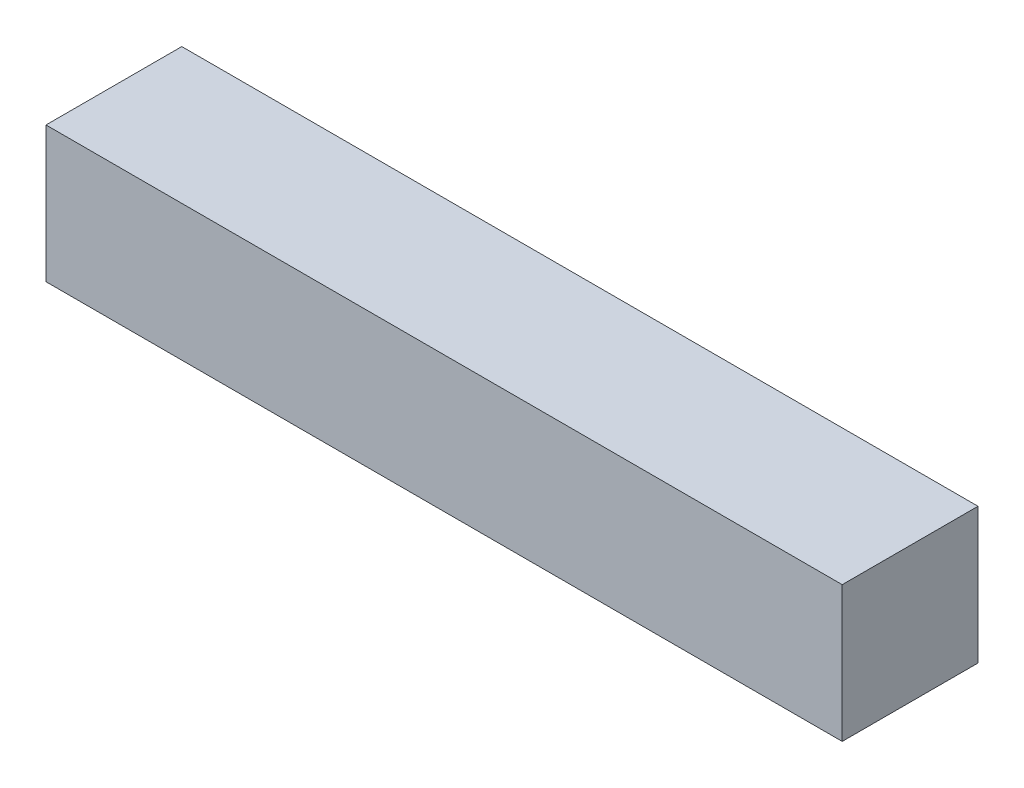
ISO-10303-21;
HEADER;
FILE_DESCRIPTION(('STEP AP214'),'2;1');
FILE_NAME('part.step','',(''),(''),'','','');
FILE_SCHEMA(('AUTOMOTIVE_DESIGN { 1 0 10303 214 1 1 1 1 }'));
ENDSEC;
DATA;
#1=APPLICATION_CONTEXT('core data for automotive mechanical design processes');
#2=APPLICATION_PROTOCOL_DEFINITION('international standard','automotive_design',2000,#1);
#3=PRODUCT_CONTEXT('',#1,'mechanical');
#4=PRODUCT('Part','Part','',(#3));
#5=PRODUCT_RELATED_PRODUCT_CATEGORY('part','',(#4));
#6=PRODUCT_DEFINITION_FORMATION('','',#4);
#7=PRODUCT_DEFINITION_CONTEXT('part definition',#1,'design');
#8=PRODUCT_DEFINITION('design','',#6,#7);
#9=PRODUCT_DEFINITION_SHAPE('','',#8);
#10=(LENGTH_UNIT() NAMED_UNIT(*) SI_UNIT(.MILLI.,.METRE.));
#11=(NAMED_UNIT(*) PLANE_ANGLE_UNIT() SI_UNIT($,.RADIAN.));
#12=(NAMED_UNIT(*) SI_UNIT($,.STERADIAN.) SOLID_ANGLE_UNIT());
#13=UNCERTAINTY_MEASURE_WITH_UNIT(LENGTH_MEASURE(1.E-05),#10,'distance_accuracy_value','');
#14=(GEOMETRIC_REPRESENTATION_CONTEXT(3) GLOBAL_UNCERTAINTY_ASSIGNED_CONTEXT((#13)) GLOBAL_UNIT_ASSIGNED_CONTEXT((#10,
#11,#12)) REPRESENTATION_CONTEXT('',''));
#15=CARTESIAN_POINT('',(0.,0.,0.));
#16=DIRECTION('',(0.,0.,1.));
#17=DIRECTION('',(1.,0.,0.));
#18=AXIS2_PLACEMENT_3D('',#15,#16,#17);
#19=CARTESIAN_POINT('',(387.,-33.,-33.));
#20=DIRECTION('',(0.,0.,1.));
#21=DIRECTION('',(1.,0.,0.));
#22=AXIS2_PLACEMENT_3D('',#19,#20,#21);
#23=PLANE('',#22);
#24=DIRECTION('',(0.,1.,0.));
#25=VECTOR('',#24,1.);
#26=CARTESIAN_POINT('',(0.,-33.,-33.));
#27=LINE('',#26,#25);
#28=CARTESIAN_POINT('',(0.,-33.,-33.));
#29=VERTEX_POINT('',#28);
#30=CARTESIAN_POINT('',(0.,33.,-33.));
#31=VERTEX_POINT('',#30);
#32=EDGE_CURVE('E107',#29,#31,#27,.T.);
#33=ORIENTED_EDGE('',*,*,#32,.T.);
#34=DIRECTION('',(-1.,0.,0.));
#35=VECTOR('',#34,1.);
#36=CARTESIAN_POINT('',(387.,33.,-33.));
#37=LINE('',#36,#35);
#38=CARTESIAN_POINT('',(387.,33.,-33.));
#39=VERTEX_POINT('',#38);
#40=EDGE_CURVE('E11',#39,#31,#37,.T.);
#41=ORIENTED_EDGE('',*,*,#40,.F.);
#42=DIRECTION('',(0.,1.,0.));
#43=VECTOR('',#42,1.);
#44=CARTESIAN_POINT('',(387.,-33.,-33.));
#45=LINE('',#44,#43);
#46=CARTESIAN_POINT('',(387.,-33.,-33.));
#47=VERTEX_POINT('',#46);
#48=EDGE_CURVE('E91',#47,#39,#45,.T.);
#49=ORIENTED_EDGE('',*,*,#48,.F.);
#50=DIRECTION('',(-1.,0.,0.));
#51=VECTOR('',#50,1.);
#52=CARTESIAN_POINT('',(387.,-33.,-33.));
#53=LINE('',#52,#51);
#54=EDGE_CURVE('E103',#47,#29,#53,.T.);
#55=ORIENTED_EDGE('',*,*,#54,.T.);
#56=EDGE_LOOP('',(#33,#41,#49,#55));
#57=FACE_BOUND('',#56,.T.);
#58=ADVANCED_FACE('F39',(#57),#23,.F.);
#59=CARTESIAN_POINT('',(387.,33.,33.));
#60=DIRECTION('',(0.,-1.,0.));
#61=DIRECTION('',(0.,0.,-1.));
#62=AXIS2_PLACEMENT_3D('',#59,#60,#61);
#63=PLANE('',#62);
#64=DIRECTION('',(0.,0.,1.));
#65=VECTOR('',#64,1.);
#66=CARTESIAN_POINT('',(0.,33.,33.));
#67=LINE('',#66,#65);
#68=CARTESIAN_POINT('',(0.,33.,33.));
#69=VERTEX_POINT('',#68);
#70=EDGE_CURVE('E96',#31,#69,#67,.T.);
#71=ORIENTED_EDGE('',*,*,#70,.T.);
#72=DIRECTION('',(-1.,0.,0.));
#73=VECTOR('',#72,1.);
#74=CARTESIAN_POINT('',(387.,33.,33.));
#75=LINE('',#74,#73);
#76=CARTESIAN_POINT('',(387.,33.,33.));
#77=VERTEX_POINT('',#76);
#78=EDGE_CURVE('E48',#77,#69,#75,.T.);
#79=ORIENTED_EDGE('',*,*,#78,.F.);
#80=DIRECTION('',(0.,0.,1.));
#81=VECTOR('',#80,1.);
#82=CARTESIAN_POINT('',(387.,33.,33.));
#83=LINE('',#82,#81);
#84=EDGE_CURVE('E86',#39,#77,#83,.T.);
#85=ORIENTED_EDGE('',*,*,#84,.F.);
#86=ORIENTED_EDGE('',*,*,#40,.T.);
#87=EDGE_LOOP('',(#71,#79,#85,#86));
#88=FACE_BOUND('',#87,.T.);
#89=ADVANCED_FACE('F95',(#88),#63,.F.);
#90=CARTESIAN_POINT('',(387.,-33.,33.));
#91=DIRECTION('',(0.,0.,-1.));
#92=DIRECTION('',(-1.,0.,0.));
#93=AXIS2_PLACEMENT_3D('',#90,#91,#92);
#94=PLANE('',#93);
#95=DIRECTION('',(0.,-1.,0.));
#96=VECTOR('',#95,1.);
#97=CARTESIAN_POINT('',(0.,-33.,33.));
#98=LINE('',#97,#96);
#99=CARTESIAN_POINT('',(0.,-33.,33.));
#100=VERTEX_POINT('',#99);
#101=EDGE_CURVE('E73',#69,#100,#98,.T.);
#102=ORIENTED_EDGE('',*,*,#101,.T.);
#103=DIRECTION('',(-1.,0.,0.));
#104=VECTOR('',#103,1.);
#105=CARTESIAN_POINT('',(387.,-33.,33.));
#106=LINE('',#105,#104);
#107=CARTESIAN_POINT('',(387.,-33.,33.));
#108=VERTEX_POINT('',#107);
#109=EDGE_CURVE('E98',#108,#100,#106,.T.);
#110=ORIENTED_EDGE('',*,*,#109,.F.);
#111=DIRECTION('',(0.,-1.,0.));
#112=VECTOR('',#111,1.);
#113=CARTESIAN_POINT('',(387.,-33.,33.));
#114=LINE('',#113,#112);
#115=EDGE_CURVE('E89',#77,#108,#114,.T.);
#116=ORIENTED_EDGE('',*,*,#115,.F.);
#117=ORIENTED_EDGE('',*,*,#78,.T.);
#118=EDGE_LOOP('',(#102,#110,#116,#117));
#119=FACE_BOUND('',#118,.T.);
#120=ADVANCED_FACE('F99',(#119),#94,.F.);
#121=CARTESIAN_POINT('',(387.,-33.,33.));
#122=DIRECTION('',(0.,1.,0.));
#123=DIRECTION('',(0.,0.,1.));
#124=AXIS2_PLACEMENT_3D('',#121,#122,#123);
#125=PLANE('',#124);
#126=DIRECTION('',(0.,0.,-1.));
#127=VECTOR('',#126,1.);
#128=CARTESIAN_POINT('',(0.,-33.,33.));
#129=LINE('',#128,#127);
#130=EDGE_CURVE('E79',#100,#29,#129,.T.);
#131=ORIENTED_EDGE('',*,*,#130,.T.);
#132=ORIENTED_EDGE('',*,*,#54,.F.);
#133=DIRECTION('',(0.,0.,-1.));
#134=VECTOR('',#133,1.);
#135=CARTESIAN_POINT('',(387.,-33.,33.));
#136=LINE('',#135,#134);
#137=EDGE_CURVE('E56',#108,#47,#136,.T.);
#138=ORIENTED_EDGE('',*,*,#137,.F.);
#139=ORIENTED_EDGE('',*,*,#109,.T.);
#140=EDGE_LOOP('',(#131,#132,#138,#139));
#141=FACE_BOUND('',#140,.T.);
#142=ADVANCED_FACE('F120',(#141),#125,.F.);
#143=CARTESIAN_POINT('',(387.,0.,0.));
#144=DIRECTION('',(-1.,0.,0.));
#145=DIRECTION('',(0.,0.,1.));
#146=AXIS2_PLACEMENT_3D('',#143,#144,#145);
#147=PLANE('',#146);
#148=ORIENTED_EDGE('',*,*,#48,.T.);
#149=ORIENTED_EDGE('',*,*,#84,.T.);
#150=ORIENTED_EDGE('',*,*,#115,.T.);
#151=ORIENTED_EDGE('',*,*,#137,.T.);
#152=EDGE_LOOP('',(#148,#149,#150,#151));
#153=FACE_BOUND('',#152,.T.);
#154=ADVANCED_FACE('F87',(#153),#147,.F.);
#155=CARTESIAN_POINT('',(0.,0.,0.));
#156=DIRECTION('',(-1.,0.,0.));
#157=DIRECTION('',(0.,0.,1.));
#158=AXIS2_PLACEMENT_3D('',#155,#156,#157);
#159=PLANE('',#158);
#160=ORIENTED_EDGE('',*,*,#32,.F.);
#161=ORIENTED_EDGE('',*,*,#130,.F.);
#162=ORIENTED_EDGE('',*,*,#101,.F.);
#163=ORIENTED_EDGE('',*,*,#70,.F.);
#164=EDGE_LOOP('',(#160,#161,#162,#163));
#165=FACE_BOUND('',#164,.T.);
#166=ADVANCED_FACE('F123',(#165),#159,.T.);
#167=CLOSED_SHELL('',(#58,#89,#120,#142,#154,#166));
#168=MANIFOLD_SOLID_BREP('B2',#167);
#169=ADVANCED_BREP_SHAPE_REPRESENTATION('',(#18,#168),#14);
#170=SHAPE_DEFINITION_REPRESENTATION(#9,#169);
ENDSEC;
END-ISO-10303-21;
